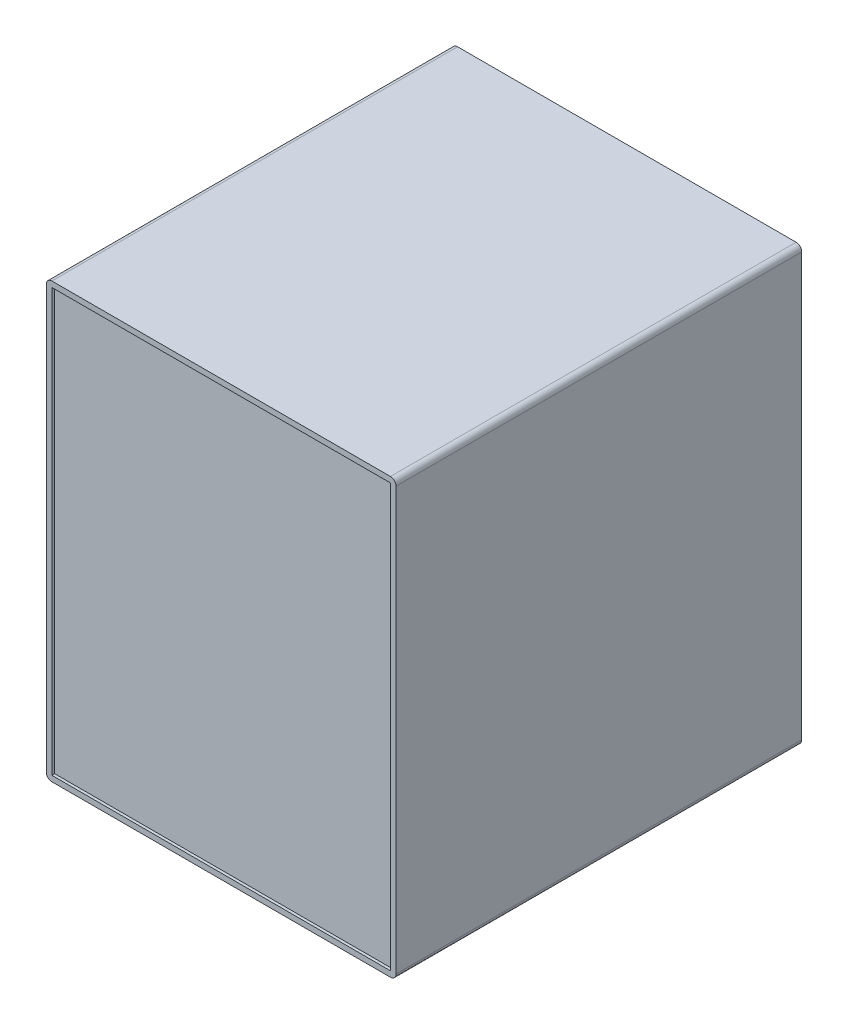
ISO-10303-21;
HEADER;
FILE_DESCRIPTION(('STEP AP214'),'2;1');
FILE_NAME('part.step','',(''),(''),'','','');
FILE_SCHEMA(('AUTOMOTIVE_DESIGN { 1 0 10303 214 1 1 1 1 }'));
ENDSEC;
DATA;
#1=APPLICATION_CONTEXT('core data for automotive mechanical design processes');
#2=APPLICATION_PROTOCOL_DEFINITION('international standard','automotive_design',2000,#1);
#3=PRODUCT_CONTEXT('',#1,'mechanical');
#4=PRODUCT('Part','Part','',(#3));
#5=PRODUCT_RELATED_PRODUCT_CATEGORY('part','',(#4));
#6=PRODUCT_DEFINITION_FORMATION('','',#4);
#7=PRODUCT_DEFINITION_CONTEXT('part definition',#1,'design');
#8=PRODUCT_DEFINITION('design','',#6,#7);
#9=PRODUCT_DEFINITION_SHAPE('','',#8);
#10=(LENGTH_UNIT() NAMED_UNIT(*) SI_UNIT(.MILLI.,.METRE.));
#11=(NAMED_UNIT(*) PLANE_ANGLE_UNIT() SI_UNIT($,.RADIAN.));
#12=(NAMED_UNIT(*) SI_UNIT($,.STERADIAN.) SOLID_ANGLE_UNIT());
#13=UNCERTAINTY_MEASURE_WITH_UNIT(LENGTH_MEASURE(1.E-05),#10,'distance_accuracy_value','');
#14=(GEOMETRIC_REPRESENTATION_CONTEXT(3) GLOBAL_UNCERTAINTY_ASSIGNED_CONTEXT((#13)) GLOBAL_UNIT_ASSIGNED_CONTEXT((#10,
#11,#12)) REPRESENTATION_CONTEXT('',''));
#15=CARTESIAN_POINT('',(0.,0.,0.));
#16=DIRECTION('',(0.,0.,1.));
#17=DIRECTION('',(1.,0.,0.));
#18=AXIS2_PLACEMENT_3D('',#15,#16,#17);
#19=CARTESIAN_POINT('',(0.,0.,145.));
#20=DIRECTION('',(1.,0.,0.));
#21=DIRECTION('',(0.,0.,-1.));
#22=AXIS2_PLACEMENT_3D('',#19,#20,#21);
#23=PLANE('',#22);
#24=DIRECTION('',(0.,-1.,0.));
#25=VECTOR('',#24,1.);
#26=CARTESIAN_POINT('',(0.,0.,0.));
#27=LINE('',#26,#25);
#28=CARTESIAN_POINT('',(0.,153.,0.));
#29=VERTEX_POINT('',#28);
#30=CARTESIAN_POINT('',(0.,2.,0.));
#31=VERTEX_POINT('',#30);
#32=EDGE_CURVE('E176',#29,#31,#27,.T.);
#33=ORIENTED_EDGE('',*,*,#32,.T.);
#34=DIRECTION('',(0.,0.,-1.));
#35=VECTOR('',#34,1.);
#36=CARTESIAN_POINT('',(0.,2.,145.));
#37=LINE('',#36,#35);
#38=CARTESIAN_POINT('',(0.,2.,145.));
#39=VERTEX_POINT('',#38);
#40=EDGE_CURVE('E217',#31,#39,#37,.F.);
#41=ORIENTED_EDGE('',*,*,#40,.T.);
#42=DIRECTION('',(0.,-1.,0.));
#43=VECTOR('',#42,1.);
#44=CARTESIAN_POINT('',(0.,0.,145.));
#45=LINE('',#44,#43);
#46=CARTESIAN_POINT('',(0.,153.,145.));
#47=VERTEX_POINT('',#46);
#48=EDGE_CURVE('E183',#47,#39,#45,.T.);
#49=ORIENTED_EDGE('',*,*,#48,.F.);
#50=DIRECTION('',(0.,0.,-1.));
#51=VECTOR('',#50,1.);
#52=CARTESIAN_POINT('',(0.,153.,145.));
#53=LINE('',#52,#51);
#54=EDGE_CURVE('E214',#47,#29,#53,.T.);
#55=ORIENTED_EDGE('',*,*,#54,.T.);
#56=EDGE_LOOP('',(#33,#41,#49,#55));
#57=FACE_BOUND('',#56,.T.);
#58=ADVANCED_FACE('F46',(#57),#23,.F.);
#59=CARTESIAN_POINT('',(0.,0.,145.));
#60=DIRECTION('',(0.,1.,0.));
#61=DIRECTION('',(0.,0.,1.));
#62=AXIS2_PLACEMENT_3D('',#59,#60,#61);
#63=PLANE('',#62);
#64=CARTESIAN_POINT('',(62.532008196197,0.,72.5));
#65=DIRECTION('',(0.,-1.,0.));
#66=DIRECTION('',(0.,0.,-1.));
#67=AXIS2_PLACEMENT_3D('',#64,#65,#66);
#68=CIRCLE('',#67,5.);
#69=CARTESIAN_POINT('',(62.532008196197,0.,67.5));
#70=VERTEX_POINT('',#69);
#71=EDGE_CURVE('E146',#70,#70,#68,.T.);
#72=ORIENTED_EDGE('',*,*,#71,.F.);
#73=EDGE_LOOP('',(#72));
#74=FACE_BOUND('',#73,.T.);
#75=DIRECTION('',(1.,0.,0.));
#76=VECTOR('',#75,1.);
#77=CARTESIAN_POINT('',(0.,0.,0.));
#78=LINE('',#77,#76);
#79=CARTESIAN_POINT('',(2.,0.,0.));
#80=VERTEX_POINT('',#79);
#81=CARTESIAN_POINT('',(123.,0.,0.));
#82=VERTEX_POINT('',#81);
#83=EDGE_CURVE('E197',#80,#82,#78,.T.);
#84=ORIENTED_EDGE('',*,*,#83,.T.);
#85=DIRECTION('',(0.,0.,-1.));
#86=VECTOR('',#85,1.);
#87=CARTESIAN_POINT('',(123.,0.,145.));
#88=LINE('',#87,#86);
#89=CARTESIAN_POINT('',(123.,0.,145.));
#90=VERTEX_POINT('',#89);
#91=EDGE_CURVE('E54',#82,#90,#88,.F.);
#92=ORIENTED_EDGE('',*,*,#91,.T.);
#93=DIRECTION('',(1.,0.,0.));
#94=VECTOR('',#93,1.);
#95=CARTESIAN_POINT('',(0.,0.,145.));
#96=LINE('',#95,#94);
#97=CARTESIAN_POINT('',(2.,0.,145.));
#98=VERTEX_POINT('',#97);
#99=EDGE_CURVE('E186',#98,#90,#96,.T.);
#100=ORIENTED_EDGE('',*,*,#99,.F.);
#101=DIRECTION('',(0.,0.,-1.));
#102=VECTOR('',#101,1.);
#103=CARTESIAN_POINT('',(2.,0.,145.));
#104=LINE('',#103,#102);
#105=EDGE_CURVE('E194',#98,#80,#104,.T.);
#106=ORIENTED_EDGE('',*,*,#105,.T.);
#107=EDGE_LOOP('',(#84,#92,#100,#106));
#108=FACE_BOUND('',#107,.T.);
#109=ADVANCED_FACE('F269',(#74,#108),#63,.F.);
#110=CARTESIAN_POINT('',(125.,0.,145.));
#111=DIRECTION('',(-1.,0.,0.));
#112=DIRECTION('',(0.,0.,1.));
#113=AXIS2_PLACEMENT_3D('',#110,#111,#112);
#114=PLANE('',#113);
#115=DIRECTION('',(0.,1.,0.));
#116=VECTOR('',#115,1.);
#117=CARTESIAN_POINT('',(125.,0.,145.));
#118=LINE('',#117,#116);
#119=CARTESIAN_POINT('',(125.,2.,145.));
#120=VERTEX_POINT('',#119);
#121=CARTESIAN_POINT('',(125.,153.,145.));
#122=VERTEX_POINT('',#121);
#123=EDGE_CURVE('E189',#120,#122,#118,.T.);
#124=ORIENTED_EDGE('',*,*,#123,.F.);
#125=DIRECTION('',(0.,0.,-1.));
#126=VECTOR('',#125,1.);
#127=CARTESIAN_POINT('',(125.,2.,145.));
#128=LINE('',#127,#126);
#129=CARTESIAN_POINT('',(125.,2.,0.));
#130=VERTEX_POINT('',#129);
#131=EDGE_CURVE('E235',#120,#130,#128,.T.);
#132=ORIENTED_EDGE('',*,*,#131,.T.);
#133=DIRECTION('',(0.,1.,0.));
#134=VECTOR('',#133,1.);
#135=CARTESIAN_POINT('',(125.,0.,0.));
#136=LINE('',#135,#134);
#137=CARTESIAN_POINT('',(125.,153.,0.));
#138=VERTEX_POINT('',#137);
#139=EDGE_CURVE('E199',#130,#138,#136,.T.);
#140=ORIENTED_EDGE('',*,*,#139,.T.);
#141=DIRECTION('',(0.,0.,-1.));
#142=VECTOR('',#141,1.);
#143=CARTESIAN_POINT('',(125.,153.,145.));
#144=LINE('',#143,#142);
#145=EDGE_CURVE('E232',#138,#122,#144,.F.);
#146=ORIENTED_EDGE('',*,*,#145,.T.);
#147=EDGE_LOOP('',(#124,#132,#140,#146));
#148=FACE_BOUND('',#147,.T.);
#149=ADVANCED_FACE('F241',(#148),#114,.F.);
#150=CARTESIAN_POINT('',(0.,155.,145.));
#151=DIRECTION('',(0.,-1.,0.));
#152=DIRECTION('',(0.,0.,-1.));
#153=AXIS2_PLACEMENT_3D('',#150,#151,#152);
#154=PLANE('',#153);
#155=DIRECTION('',(-1.,0.,0.));
#156=VECTOR('',#155,1.);
#157=CARTESIAN_POINT('',(0.,155.,145.));
#158=LINE('',#157,#156);
#159=CARTESIAN_POINT('',(123.,155.,145.));
#160=VERTEX_POINT('',#159);
#161=CARTESIAN_POINT('',(2.,155.,145.));
#162=VERTEX_POINT('',#161);
#163=EDGE_CURVE('E191',#160,#162,#158,.T.);
#164=ORIENTED_EDGE('',*,*,#163,.F.);
#165=DIRECTION('',(0.,0.,-1.));
#166=VECTOR('',#165,1.);
#167=CARTESIAN_POINT('',(123.,155.,145.));
#168=LINE('',#167,#166);
#169=CARTESIAN_POINT('',(123.,155.,0.));
#170=VERTEX_POINT('',#169);
#171=EDGE_CURVE('E229',#160,#170,#168,.T.);
#172=ORIENTED_EDGE('',*,*,#171,.T.);
#173=DIRECTION('',(-1.,0.,0.));
#174=VECTOR('',#173,1.);
#175=CARTESIAN_POINT('',(0.,155.,0.));
#176=LINE('',#175,#174);
#177=CARTESIAN_POINT('',(2.,155.,0.));
#178=VERTEX_POINT('',#177);
#179=EDGE_CURVE('E187',#170,#178,#176,.T.);
#180=ORIENTED_EDGE('',*,*,#179,.T.);
#181=DIRECTION('',(0.,0.,-1.));
#182=VECTOR('',#181,1.);
#183=CARTESIAN_POINT('',(2.,155.,145.));
#184=LINE('',#183,#182);
#185=EDGE_CURVE('E227',#178,#162,#184,.F.);
#186=ORIENTED_EDGE('',*,*,#185,.T.);
#187=EDGE_LOOP('',(#164,#172,#180,#186));
#188=FACE_BOUND('',#187,.T.);
#189=ADVANCED_FACE('F256',(#188),#154,.F.);
#190=CARTESIAN_POINT('',(0.,0.,145.));
#191=DIRECTION('',(0.,0.,-1.));
#192=DIRECTION('',(-1.,0.,0.));
#193=AXIS2_PLACEMENT_3D('',#190,#191,#192);
#194=PLANE('',#193);
#195=DIRECTION('',(1.,0.,0.));
#196=VECTOR('',#195,1.);
#197=CARTESIAN_POINT('',(2.00000000000002,2.,145.));
#198=LINE('',#197,#196);
#199=CARTESIAN_POINT('',(2.00000000000002,2.,145.));
#200=VERTEX_POINT('',#199);
#201=CARTESIAN_POINT('',(123.,2.,145.));
#202=VERTEX_POINT('',#201);
#203=EDGE_CURVE('E148',#200,#202,#198,.T.);
#204=ORIENTED_EDGE('',*,*,#203,.F.);
#205=DIRECTION('',(0.,-1.,0.));
#206=VECTOR('',#205,1.);
#207=CARTESIAN_POINT('',(2.,153.,145.));
#208=LINE('',#207,#206);
#209=CARTESIAN_POINT('',(2.,153.,145.));
#210=VERTEX_POINT('',#209);
#211=EDGE_CURVE('E145',#210,#200,#208,.T.);
#212=ORIENTED_EDGE('',*,*,#211,.F.);
#213=DIRECTION('',(-1.,0.,0.));
#214=VECTOR('',#213,1.);
#215=CARTESIAN_POINT('',(2.,153.,145.));
#216=LINE('',#215,#214);
#217=CARTESIAN_POINT('',(123.,153.,145.));
#218=VERTEX_POINT('',#217);
#219=EDGE_CURVE('E157',#218,#210,#216,.T.);
#220=ORIENTED_EDGE('',*,*,#219,.F.);
#221=DIRECTION('',(0.,1.,0.));
#222=VECTOR('',#221,1.);
#223=CARTESIAN_POINT('',(123.,153.,145.));
#224=LINE('',#223,#222);
#225=EDGE_CURVE('E169',#202,#218,#224,.T.);
#226=ORIENTED_EDGE('',*,*,#225,.F.);
#227=EDGE_LOOP('',(#204,#212,#220,#226));
#228=FACE_BOUND('',#227,.T.);
#229=ORIENTED_EDGE('',*,*,#99,.T.);
#230=CARTESIAN_POINT('',(123.,2.,145.));
#231=DIRECTION('',(0.,0.,-1.));
#232=DIRECTION('',(-1.,0.,0.));
#233=AXIS2_PLACEMENT_3D('',#230,#231,#232);
#234=CIRCLE('',#233,2.);
#235=EDGE_CURVE('E11',#90,#120,#234,.F.);
#236=ORIENTED_EDGE('',*,*,#235,.T.);
#237=ORIENTED_EDGE('',*,*,#123,.T.);
#238=CARTESIAN_POINT('',(123.,153.,145.));
#239=DIRECTION('',(0.,0.,-1.));
#240=DIRECTION('',(-1.,0.,0.));
#241=AXIS2_PLACEMENT_3D('',#238,#239,#240);
#242=CIRCLE('',#241,2.);
#243=EDGE_CURVE('E222',#122,#160,#242,.F.);
#244=ORIENTED_EDGE('',*,*,#243,.T.);
#245=ORIENTED_EDGE('',*,*,#163,.T.);
#246=CARTESIAN_POINT('',(2.,153.,145.));
#247=DIRECTION('',(0.,0.,-1.));
#248=DIRECTION('',(-1.,0.,0.));
#249=AXIS2_PLACEMENT_3D('',#246,#247,#248);
#250=CIRCLE('',#249,2.);
#251=EDGE_CURVE('E220',#162,#47,#250,.F.);
#252=ORIENTED_EDGE('',*,*,#251,.T.);
#253=ORIENTED_EDGE('',*,*,#48,.T.);
#254=CARTESIAN_POINT('',(2.,2.,145.));
#255=DIRECTION('',(0.,0.,-1.));
#256=DIRECTION('',(-1.,0.,0.));
#257=AXIS2_PLACEMENT_3D('',#254,#255,#256);
#258=CIRCLE('',#257,2.);
#259=EDGE_CURVE('E224',#39,#98,#258,.F.);
#260=ORIENTED_EDGE('',*,*,#259,.T.);
#261=EDGE_LOOP('',(#229,#236,#237,#244,#245,#252,#253,#260));
#262=FACE_BOUND('',#261,.T.);
#263=ADVANCED_FACE('F253',(#228,#262),#194,.F.);
#264=CARTESIAN_POINT('',(0.,0.,0.));
#265=DIRECTION('',(0.,0.,-1.));
#266=DIRECTION('',(-1.,0.,0.));
#267=AXIS2_PLACEMENT_3D('',#264,#265,#266);
#268=PLANE('',#267);
#269=ORIENTED_EDGE('',*,*,#139,.F.);
#270=CARTESIAN_POINT('',(123.,2.,0.));
#271=DIRECTION('',(0.,0.,-1.));
#272=DIRECTION('',(-1.,0.,0.));
#273=AXIS2_PLACEMENT_3D('',#270,#271,#272);
#274=CIRCLE('',#273,2.);
#275=EDGE_CURVE('E68',#130,#82,#274,.T.);
#276=ORIENTED_EDGE('',*,*,#275,.T.);
#277=ORIENTED_EDGE('',*,*,#83,.F.);
#278=CARTESIAN_POINT('',(2.,2.,0.));
#279=DIRECTION('',(0.,0.,-1.));
#280=DIRECTION('',(-1.,0.,0.));
#281=AXIS2_PLACEMENT_3D('',#278,#279,#280);
#282=CIRCLE('',#281,2.);
#283=EDGE_CURVE('E211',#80,#31,#282,.T.);
#284=ORIENTED_EDGE('',*,*,#283,.T.);
#285=ORIENTED_EDGE('',*,*,#32,.F.);
#286=CARTESIAN_POINT('',(2.,153.,0.));
#287=DIRECTION('',(0.,0.,-1.));
#288=DIRECTION('',(-1.,0.,0.));
#289=AXIS2_PLACEMENT_3D('',#286,#287,#288);
#290=CIRCLE('',#289,2.);
#291=EDGE_CURVE('E206',#29,#178,#290,.T.);
#292=ORIENTED_EDGE('',*,*,#291,.T.);
#293=ORIENTED_EDGE('',*,*,#179,.F.);
#294=CARTESIAN_POINT('',(123.,153.,0.));
#295=DIRECTION('',(0.,0.,-1.));
#296=DIRECTION('',(-1.,0.,0.));
#297=AXIS2_PLACEMENT_3D('',#294,#295,#296);
#298=CIRCLE('',#297,2.);
#299=EDGE_CURVE('E208',#170,#138,#298,.T.);
#300=ORIENTED_EDGE('',*,*,#299,.T.);
#301=EDGE_LOOP('',(#269,#276,#277,#284,#285,#292,#293,#300));
#302=FACE_BOUND('',#301,.T.);
#303=ADVANCED_FACE('F244',(#302),#268,.T.);
#304=CARTESIAN_POINT('',(2.,153.,144.));
#305=DIRECTION('',(-1.,0.,0.));
#306=DIRECTION('',(0.,-1.,0.));
#307=AXIS2_PLACEMENT_3D('',#304,#305,#306);
#308=PLANE('',#307);
#309=ORIENTED_EDGE('',*,*,#211,.T.);
#310=DIRECTION('',(0.,0.,1.));
#311=VECTOR('',#310,1.);
#312=CARTESIAN_POINT('',(2.00000000000002,2.,144.));
#313=LINE('',#312,#311);
#314=CARTESIAN_POINT('',(2.00000000000002,2.,144.));
#315=VERTEX_POINT('',#314);
#316=EDGE_CURVE('E165',#315,#200,#313,.T.);
#317=ORIENTED_EDGE('',*,*,#316,.F.);
#318=DIRECTION('',(0.,-1.,0.));
#319=VECTOR('',#318,1.);
#320=CARTESIAN_POINT('',(2.,153.,144.));
#321=LINE('',#320,#319);
#322=CARTESIAN_POINT('',(2.,153.,144.));
#323=VERTEX_POINT('',#322);
#324=EDGE_CURVE('E153',#323,#315,#321,.T.);
#325=ORIENTED_EDGE('',*,*,#324,.F.);
#326=DIRECTION('',(0.,0.,1.));
#327=VECTOR('',#326,1.);
#328=CARTESIAN_POINT('',(2.,153.,144.));
#329=LINE('',#328,#327);
#330=EDGE_CURVE('E174',#323,#210,#329,.T.);
#331=ORIENTED_EDGE('',*,*,#330,.T.);
#332=EDGE_LOOP('',(#309,#317,#325,#331));
#333=FACE_BOUND('',#332,.T.);
#334=ADVANCED_FACE('F346',(#333),#308,.F.);
#335=CARTESIAN_POINT('',(2.,153.,144.));
#336=DIRECTION('',(0.,1.,0.));
#337=DIRECTION('',(0.,0.,1.));
#338=AXIS2_PLACEMENT_3D('',#335,#336,#337);
#339=PLANE('',#338);
#340=ORIENTED_EDGE('',*,*,#219,.T.);
#341=ORIENTED_EDGE('',*,*,#330,.F.);
#342=DIRECTION('',(-1.,0.,0.));
#343=VECTOR('',#342,1.);
#344=CARTESIAN_POINT('',(2.,153.,144.));
#345=LINE('',#344,#343);
#346=CARTESIAN_POINT('',(123.,153.,144.));
#347=VERTEX_POINT('',#346);
#348=EDGE_CURVE('E163',#347,#323,#345,.T.);
#349=ORIENTED_EDGE('',*,*,#348,.F.);
#350=DIRECTION('',(0.,0.,1.));
#351=VECTOR('',#350,1.);
#352=CARTESIAN_POINT('',(123.,153.,144.));
#353=LINE('',#352,#351);
#354=EDGE_CURVE('E177',#347,#218,#353,.T.);
#355=ORIENTED_EDGE('',*,*,#354,.T.);
#356=EDGE_LOOP('',(#340,#341,#349,#355));
#357=FACE_BOUND('',#356,.T.);
#358=ADVANCED_FACE('F431',(#357),#339,.F.);
#359=CARTESIAN_POINT('',(123.,153.,144.));
#360=DIRECTION('',(1.,0.,0.));
#361=DIRECTION('',(0.,1.,0.));
#362=AXIS2_PLACEMENT_3D('',#359,#360,#361);
#363=PLANE('',#362);
#364=ORIENTED_EDGE('',*,*,#225,.T.);
#365=ORIENTED_EDGE('',*,*,#354,.F.);
#366=DIRECTION('',(0.,1.,0.));
#367=VECTOR('',#366,1.);
#368=CARTESIAN_POINT('',(123.,153.,144.));
#369=LINE('',#368,#367);
#370=CARTESIAN_POINT('',(123.,2.,144.));
#371=VERTEX_POINT('',#370);
#372=EDGE_CURVE('E160',#371,#347,#369,.T.);
#373=ORIENTED_EDGE('',*,*,#372,.F.);
#374=DIRECTION('',(0.,0.,1.));
#375=VECTOR('',#374,1.);
#376=CARTESIAN_POINT('',(123.,2.,144.));
#377=LINE('',#376,#375);
#378=EDGE_CURVE('E179',#371,#202,#377,.T.);
#379=ORIENTED_EDGE('',*,*,#378,.T.);
#380=EDGE_LOOP('',(#364,#365,#373,#379));
#381=FACE_BOUND('',#380,.T.);
#382=ADVANCED_FACE('F419',(#381),#363,.F.);
#383=CARTESIAN_POINT('',(2.00000000000002,2.,144.));
#384=DIRECTION('',(0.,-1.,0.));
#385=DIRECTION('',(0.,0.,-1.));
#386=AXIS2_PLACEMENT_3D('',#383,#384,#385);
#387=PLANE('',#386);
#388=ORIENTED_EDGE('',*,*,#203,.T.);
#389=ORIENTED_EDGE('',*,*,#378,.F.);
#390=DIRECTION('',(1.,0.,0.));
#391=VECTOR('',#390,1.);
#392=CARTESIAN_POINT('',(2.00000000000002,2.,144.));
#393=LINE('',#392,#391);
#394=EDGE_CURVE('E156',#315,#371,#393,.T.);
#395=ORIENTED_EDGE('',*,*,#394,.F.);
#396=ORIENTED_EDGE('',*,*,#316,.T.);
#397=EDGE_LOOP('',(#388,#389,#395,#396));
#398=FACE_BOUND('',#397,.T.);
#399=ADVANCED_FACE('F408',(#398),#387,.F.);
#400=CARTESIAN_POINT('',(0.,0.,144.));
#401=DIRECTION('',(0.,0.,1.));
#402=DIRECTION('',(1.,0.,0.));
#403=AXIS2_PLACEMENT_3D('',#400,#401,#402);
#404=PLANE('',#403);
#405=ORIENTED_EDGE('',*,*,#324,.T.);
#406=ORIENTED_EDGE('',*,*,#394,.T.);
#407=ORIENTED_EDGE('',*,*,#372,.T.);
#408=ORIENTED_EDGE('',*,*,#348,.T.);
#409=EDGE_LOOP('',(#405,#406,#407,#408));
#410=FACE_BOUND('',#409,.T.);
#411=ADVANCED_FACE('F287',(#410),#404,.T.);
#412=CARTESIAN_POINT('',(2.,2.,145.));
#413=DIRECTION('',(0.,0.,-1.));
#414=DIRECTION('',(-1.,0.,0.));
#415=AXIS2_PLACEMENT_3D('',#412,#413,#414);
#416=CYLINDRICAL_SURFACE('',#415,2.);
#417=ORIENTED_EDGE('',*,*,#259,.F.);
#418=ORIENTED_EDGE('',*,*,#40,.F.);
#419=ORIENTED_EDGE('',*,*,#283,.F.);
#420=ORIENTED_EDGE('',*,*,#105,.F.);
#421=EDGE_LOOP('',(#417,#418,#419,#420));
#422=FACE_BOUND('',#421,.T.);
#423=ADVANCED_FACE('F267',(#422),#416,.T.);
#424=CARTESIAN_POINT('',(123.,153.,145.));
#425=DIRECTION('',(0.,0.,-1.));
#426=DIRECTION('',(-1.,0.,0.));
#427=AXIS2_PLACEMENT_3D('',#424,#425,#426);
#428=CYLINDRICAL_SURFACE('',#427,2.);
#429=ORIENTED_EDGE('',*,*,#243,.F.);
#430=ORIENTED_EDGE('',*,*,#145,.F.);
#431=ORIENTED_EDGE('',*,*,#299,.F.);
#432=ORIENTED_EDGE('',*,*,#171,.F.);
#433=EDGE_LOOP('',(#429,#430,#431,#432));
#434=FACE_BOUND('',#433,.T.);
#435=ADVANCED_FACE('F250',(#434),#428,.T.);
#436=CARTESIAN_POINT('',(2.,153.,145.));
#437=DIRECTION('',(0.,0.,-1.));
#438=DIRECTION('',(-1.,0.,0.));
#439=AXIS2_PLACEMENT_3D('',#436,#437,#438);
#440=CYLINDRICAL_SURFACE('',#439,2.);
#441=ORIENTED_EDGE('',*,*,#251,.F.);
#442=ORIENTED_EDGE('',*,*,#185,.F.);
#443=ORIENTED_EDGE('',*,*,#291,.F.);
#444=ORIENTED_EDGE('',*,*,#54,.F.);
#445=EDGE_LOOP('',(#441,#442,#443,#444));
#446=FACE_BOUND('',#445,.T.);
#447=ADVANCED_FACE('F259',(#446),#440,.T.);
#448=CARTESIAN_POINT('',(123.,2.,145.));
#449=DIRECTION('',(0.,0.,-1.));
#450=DIRECTION('',(-1.,0.,0.));
#451=AXIS2_PLACEMENT_3D('',#448,#449,#450);
#452=CYLINDRICAL_SURFACE('',#451,2.);
#453=ORIENTED_EDGE('',*,*,#235,.F.);
#454=ORIENTED_EDGE('',*,*,#91,.F.);
#455=ORIENTED_EDGE('',*,*,#275,.F.);
#456=ORIENTED_EDGE('',*,*,#131,.F.);
#457=EDGE_LOOP('',(#453,#454,#455,#456));
#458=FACE_BOUND('',#457,.T.);
#459=ADVANCED_FACE('F48',(#458),#452,.T.);
#460=CARTESIAN_POINT('',(62.532008196197,20.,72.5));
#461=DIRECTION('',(0.,-1.,0.));
#462=DIRECTION('',(0.,0.,-1.));
#463=AXIS2_PLACEMENT_3D('',#460,#461,#462);
#464=CONICAL_SURFACE('',#463,4.99999999999999,1.02974425867665);
#465=CARTESIAN_POINT('',(62.532008196197,23.0043030951378,72.5));
#466=VERTEX_POINT('',#465);
#467=VERTEX_LOOP('',#466);
#468=FACE_BOUND('',#467,.T.);
#469=CARTESIAN_POINT('',(62.532008196197,20.,72.5));
#470=DIRECTION('',(0.,-1.,0.));
#471=DIRECTION('',(0.,0.,-1.));
#472=AXIS2_PLACEMENT_3D('',#469,#470,#471);
#473=CIRCLE('',#472,4.99999999999999);
#474=CARTESIAN_POINT('',(62.532008196197,20.,67.5));
#475=VERTEX_POINT('',#474);
#476=EDGE_CURVE('E143',#475,#475,#473,.T.);
#477=ORIENTED_EDGE('',*,*,#476,.T.);
#478=EDGE_LOOP('',(#477));
#479=FACE_BOUND('',#478,.T.);
#480=ADVANCED_FACE('F136',(#468,#479),#464,.F.);
#481=CARTESIAN_POINT('',(62.532008196197,0.,72.5));
#482=DIRECTION('',(0.,-1.,0.));
#483=DIRECTION('',(0.,0.,-1.));
#484=AXIS2_PLACEMENT_3D('',#481,#482,#483);
#485=CYLINDRICAL_SURFACE('',#484,5.);
#486=ORIENTED_EDGE('',*,*,#476,.F.);
#487=EDGE_LOOP('',(#486));
#488=FACE_BOUND('',#487,.T.);
#489=ORIENTED_EDGE('',*,*,#71,.T.);
#490=EDGE_LOOP('',(#489));
#491=FACE_BOUND('',#490,.T.);
#492=ADVANCED_FACE('F139',(#488,#491),#485,.F.);
#493=CLOSED_SHELL('',(#58,#109,#149,#189,#263,#303,#334,#358,#382,#399,#411,#423,#435,#447,#459,
#480,#492));
#494=MANIFOLD_SOLID_BREP('B2',#493);
#495=ADVANCED_BREP_SHAPE_REPRESENTATION('',(#18,#494),#14);
#496=SHAPE_DEFINITION_REPRESENTATION(#9,#495);
ENDSEC;
END-ISO-10303-21;
